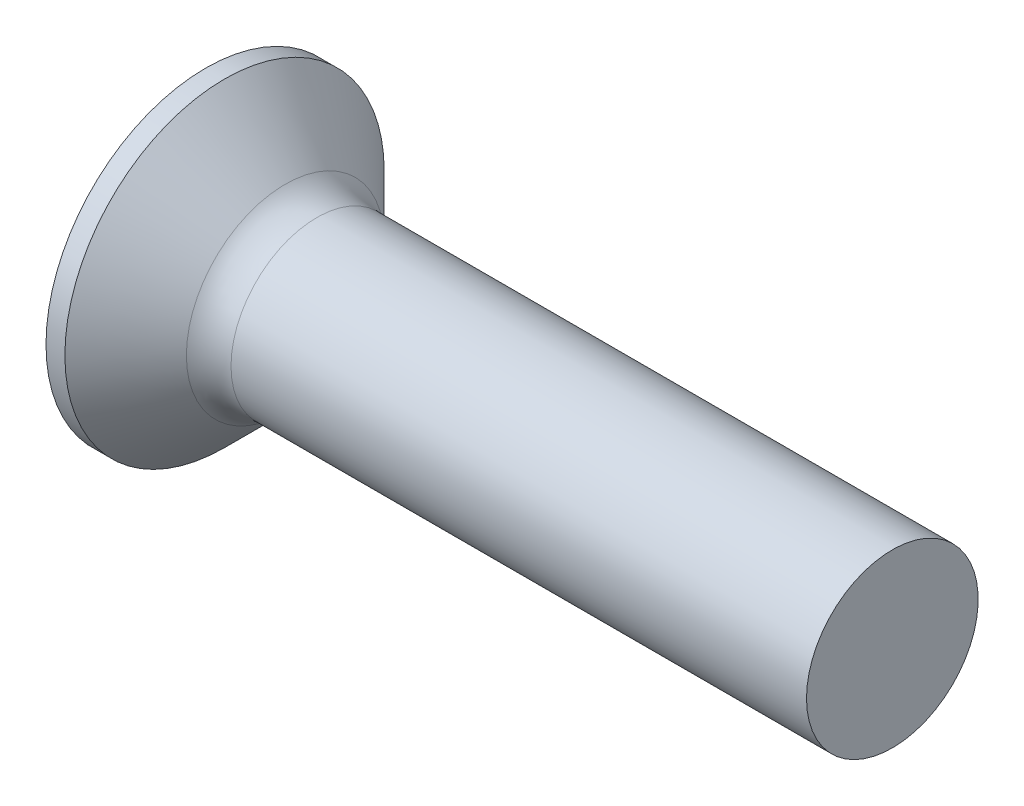
ISO-10303-21;
HEADER;
FILE_DESCRIPTION(('STEP AP214'),'2;1');
FILE_NAME('part.step','',(''),(''),'','','');
FILE_SCHEMA(('AUTOMOTIVE_DESIGN { 1 0 10303 214 1 1 1 1 }'));
ENDSEC;
DATA;
#1=APPLICATION_CONTEXT('core data for automotive mechanical design processes');
#2=APPLICATION_PROTOCOL_DEFINITION('international standard','automotive_design',2000,#1);
#3=PRODUCT_CONTEXT('',#1,'mechanical');
#4=PRODUCT('Part','Part','',(#3));
#5=PRODUCT_RELATED_PRODUCT_CATEGORY('part','',(#4));
#6=PRODUCT_DEFINITION_FORMATION('','',#4);
#7=PRODUCT_DEFINITION_CONTEXT('part definition',#1,'design');
#8=PRODUCT_DEFINITION('design','',#6,#7);
#9=PRODUCT_DEFINITION_SHAPE('','',#8);
#10=(LENGTH_UNIT() NAMED_UNIT(*) SI_UNIT(.MILLI.,.METRE.));
#11=(NAMED_UNIT(*) PLANE_ANGLE_UNIT() SI_UNIT($,.RADIAN.));
#12=(NAMED_UNIT(*) SI_UNIT($,.STERADIAN.) SOLID_ANGLE_UNIT());
#13=UNCERTAINTY_MEASURE_WITH_UNIT(LENGTH_MEASURE(1.E-05),#10,'distance_accuracy_value','');
#14=(GEOMETRIC_REPRESENTATION_CONTEXT(3) GLOBAL_UNCERTAINTY_ASSIGNED_CONTEXT((#13)) GLOBAL_UNIT_ASSIGNED_CONTEXT((#10,
#11,#12)) REPRESENTATION_CONTEXT('',''));
#15=CARTESIAN_POINT('',(0.,0.,0.));
#16=DIRECTION('',(0.,0.,1.));
#17=DIRECTION('',(1.,0.,0.));
#18=AXIS2_PLACEMENT_3D('',#15,#16,#17);
#19=CARTESIAN_POINT('',(0.,0.,0.));
#20=DIRECTION('',(-1.,0.,0.));
#21=DIRECTION('',(0.,0.,1.));
#22=AXIS2_PLACEMENT_3D('',#19,#20,#21);
#23=PLANE('',#22);
#24=CARTESIAN_POINT('',(0.,0.,0.));
#25=DIRECTION('',(-1.,0.,0.));
#26=DIRECTION('',(0.,0.,1.));
#27=AXIS2_PLACEMENT_3D('',#24,#25,#26);
#28=CIRCLE('',#27,4.65);
#29=CARTESIAN_POINT('',(0.,0.,4.65));
#30=VERTEX_POINT('',#29);
#31=EDGE_CURVE('E323',#30,#30,#28,.T.);
#32=ORIENTED_EDGE('',*,*,#31,.T.);
#33=EDGE_LOOP('',(#32));
#34=FACE_BOUND('',#33,.T.);
#35=DIRECTION('',(0.,0.,-1.));
#36=VECTOR('',#35,1.);
#37=CARTESIAN_POINT('',(0.,-0.515000000000009,2.45));
#38=LINE('',#37,#36);
#39=CARTESIAN_POINT('',(0.,-0.515000000000009,2.45));
#40=VERTEX_POINT('',#39);
#41=CARTESIAN_POINT('',(0.,-0.515000000000003,0.931375357653024));
#42=VERTEX_POINT('',#41);
#43=EDGE_CURVE('E344',#40,#42,#38,.T.);
#44=ORIENTED_EDGE('',*,*,#43,.T.);
#45=CARTESIAN_POINT('',(0.,0.,0.));
#46=DIRECTION('',(-1.,0.,0.));
#47=DIRECTION('',(0.,0.,1.));
#48=AXIS2_PLACEMENT_3D('',#45,#46,#47);
#49=CIRCLE('',#48,1.06427677642768);
#50=CARTESIAN_POINT('',(0.,-0.931375357653026,0.515));
#51=VERTEX_POINT('',#50);
#52=EDGE_CURVE('E416',#51,#42,#49,.T.);
#53=ORIENTED_EDGE('',*,*,#52,.F.);
#54=DIRECTION('',(0.,-1.,0.));
#55=VECTOR('',#54,1.);
#56=CARTESIAN_POINT('',(0.,2.45,0.515));
#57=LINE('',#56,#55);
#58=CARTESIAN_POINT('',(0.,-2.45,0.515));
#59=VERTEX_POINT('',#58);
#60=EDGE_CURVE('E295',#51,#59,#57,.T.);
#61=ORIENTED_EDGE('',*,*,#60,.T.);
#62=DIRECTION('',(0.,0.,-1.));
#63=VECTOR('',#62,1.);
#64=CARTESIAN_POINT('',(0.,-2.45,0.515));
#65=LINE('',#64,#63);
#66=CARTESIAN_POINT('',(0.,-2.45,-0.515));
#67=VERTEX_POINT('',#66);
#68=EDGE_CURVE('E278',#59,#67,#65,.T.);
#69=ORIENTED_EDGE('',*,*,#68,.T.);
#70=DIRECTION('',(0.,1.,0.));
#71=VECTOR('',#70,1.);
#72=CARTESIAN_POINT('',(0.,-2.45,-0.515));
#73=LINE('',#72,#71);
#74=CARTESIAN_POINT('',(0.,-0.931375357653026,-0.515));
#75=VERTEX_POINT('',#74);
#76=EDGE_CURVE('E287',#67,#75,#73,.T.);
#77=ORIENTED_EDGE('',*,*,#76,.T.);
#78=CARTESIAN_POINT('',(0.,-0.514999999999997,-0.931375357653028));
#79=VERTEX_POINT('',#78);
#80=EDGE_CURVE('E401',#79,#75,#49,.T.);
#81=ORIENTED_EDGE('',*,*,#80,.F.);
#82=CARTESIAN_POINT('',(0.,-0.514999999999992,-2.45));
#83=VERTEX_POINT('',#82);
#84=EDGE_CURVE('E348',#79,#83,#38,.T.);
#85=ORIENTED_EDGE('',*,*,#84,.T.);
#86=DIRECTION('',(0.,1.,0.));
#87=VECTOR('',#86,1.);
#88=CARTESIAN_POINT('',(0.,-0.514999999999992,-2.45));
#89=LINE('',#88,#87);
#90=CARTESIAN_POINT('',(0.,0.515000000000008,-2.45));
#91=VERTEX_POINT('',#90);
#92=EDGE_CURVE('E337',#83,#91,#89,.T.);
#93=ORIENTED_EDGE('',*,*,#92,.T.);
#94=DIRECTION('',(0.,0.,1.));
#95=VECTOR('',#94,1.);
#96=CARTESIAN_POINT('',(0.,0.515000000000008,-2.45));
#97=LINE('',#96,#95);
#98=CARTESIAN_POINT('',(0.,0.515000000000003,-0.931375357653024));
#99=VERTEX_POINT('',#98);
#100=EDGE_CURVE('E352',#91,#99,#97,.T.);
#101=ORIENTED_EDGE('',*,*,#100,.T.);
#102=CARTESIAN_POINT('',(0.,0.931375357653026,-0.515));
#103=VERTEX_POINT('',#102);
#104=EDGE_CURVE('E414',#103,#99,#49,.T.);
#105=ORIENTED_EDGE('',*,*,#104,.F.);
#106=CARTESIAN_POINT('',(0.,2.45,-0.515));
#107=VERTEX_POINT('',#106);
#108=EDGE_CURVE('E290',#103,#107,#73,.T.);
#109=ORIENTED_EDGE('',*,*,#108,.T.);
#110=DIRECTION('',(0.,0.,1.));
#111=VECTOR('',#110,1.);
#112=CARTESIAN_POINT('',(0.,2.45,-0.515));
#113=LINE('',#112,#111);
#114=CARTESIAN_POINT('',(0.,2.45,0.515));
#115=VERTEX_POINT('',#114);
#116=EDGE_CURVE('E289',#107,#115,#113,.T.);
#117=ORIENTED_EDGE('',*,*,#116,.T.);
#118=CARTESIAN_POINT('',(0.,0.931375357653026,0.515));
#119=VERTEX_POINT('',#118);
#120=EDGE_CURVE('E297',#115,#119,#57,.T.);
#121=ORIENTED_EDGE('',*,*,#120,.T.);
#122=CARTESIAN_POINT('',(0.,0.514999999999996,0.931375357653028));
#123=VERTEX_POINT('',#122);
#124=EDGE_CURVE('E415',#123,#119,#49,.T.);
#125=ORIENTED_EDGE('',*,*,#124,.F.);
#126=CARTESIAN_POINT('',(0.,0.514999999999991,2.45));
#127=VERTEX_POINT('',#126);
#128=EDGE_CURVE('E355',#123,#127,#97,.T.);
#129=ORIENTED_EDGE('',*,*,#128,.T.);
#130=DIRECTION('',(0.,-1.,0.));
#131=VECTOR('',#130,1.);
#132=CARTESIAN_POINT('',(0.,0.514999999999991,2.45));
#133=LINE('',#132,#131);
#134=EDGE_CURVE('E354',#127,#40,#133,.T.);
#135=ORIENTED_EDGE('',*,*,#134,.T.);
#136=EDGE_LOOP('',(#44,#53,#61,#69,#77,#81,#85,#93,#101,#105,#109,#117,#121,#125,#129,#135));
#137=FACE_BOUND('',#136,.T.);
#138=ADVANCED_FACE('F32',(#34,#137),#23,.T.);
#139=CARTESIAN_POINT('',(3.05,-0.929326147908032,0.515));
#140=DIRECTION('',(0.,0.,-1.));
#141=DIRECTION('',(0.,1.,0.));
#142=AXIS2_PLACEMENT_3D('',#139,#140,#141);
#143=PLANE('',#142);
#144=ORIENTED_EDGE('',*,*,#60,.F.);
#145=CARTESIAN_POINT('',(-1.54221347058903,-1.05291860714859,0.515));
#146=CARTESIAN_POINT('',(-1.22007146800241,-1.02783606985067,0.515));
#147=CARTESIAN_POINT('',(-0.897941814894598,-1.00259289382691,0.515));
#148=CARTESIAN_POINT('',(-0.253713841602367,-0.951673528708394,0.515));
#149=CARTESIAN_POINT('',(0.0683844782739392,-0.925997335718344,0.515));
#150=CARTESIAN_POINT('',(0.712537341258934,-0.874100649402746,0.515));
#151=CARTESIAN_POINT('',(1.03459188436907,-0.847880156095195,0.515));
#152=CARTESIAN_POINT('',(1.67864013806642,-0.794723211090118,0.515));
#153=CARTESIAN_POINT('',(2.00063384900369,-0.767786763647266,0.515));
#154=CARTESIAN_POINT('',(2.56056239424054,-0.720091607757629,0.515));
#155=CARTESIAN_POINT('',(2.79851603156427,-0.699554136405275,0.515));
#156=CARTESIAN_POINT('',(3.27436149685826,-0.657782810337244,0.515));
#157=CARTESIAN_POINT('',(3.51225332501977,-0.636548957802634,0.515));
#158=CARTESIAN_POINT('',(3.98796007502083,-0.593165171209449,0.515));
#159=CARTESIAN_POINT('',(4.22577499483827,-0.571015214770186,0.515));
#160=CARTESIAN_POINT('',(4.70127802510734,-0.525368928080089,0.515));
#161=CARTESIAN_POINT('',(4.93896613402064,-0.501872581855082,0.515));
#162=CARTESIAN_POINT('',(5.17656597211643,-0.477487907039094,0.515));
#163=B_SPLINE_CURVE_WITH_KNOTS('',3,(#145,#146,#147,#148,#149,#150,#151,#152,#153,#154,#155,
#156,#157,#158,#159,#160,#161,#162),.UNSPECIFIED.,.F.,.F.,(4,2,2,2,2,2,2,2,4),(0.,
0.969351235034601,1.93871119472626,2.90807112236582,3.87742529071622,4.59393929261848,
5.3104510506131,6.02698032355223,6.74351809947659),.UNSPECIFIED.);
#164=CARTESIAN_POINT('',(3.05,-0.677477674908922,0.515));
#165=VERTEX_POINT('',#164);
#166=EDGE_CURVE('E392',#51,#165,#163,.T.);
#167=ORIENTED_EDGE('',*,*,#166,.T.);
#168=DIRECTION('',(0.,-1.,0.));
#169=VECTOR('',#168,1.);
#170=CARTESIAN_POINT('',(3.05,0.929326147908032,0.515));
#171=LINE('',#170,#169);
#172=CARTESIAN_POINT('',(3.05,-0.929326147908032,0.515));
#173=VERTEX_POINT('',#172);
#174=EDGE_CURVE('E313',#165,#173,#171,.T.);
#175=ORIENTED_EDGE('',*,*,#174,.T.);
#176=DIRECTION('',(0.89493436774996,0.446197800778958,0.));
#177=VECTOR('',#176,1.);
#178=CARTESIAN_POINT('',(0.,-2.45,0.515));
#179=LINE('',#178,#177);
#180=EDGE_CURVE('E284',#59,#173,#179,.T.);
#181=ORIENTED_EDGE('',*,*,#180,.F.);
#182=EDGE_LOOP('',(#144,#167,#175,#181));
#183=FACE_BOUND('',#182,.T.);
#184=ADVANCED_FACE('F164',(#183),#143,.T.);
#185=CARTESIAN_POINT('',(3.05,0.929326147908032,0.515));
#186=VERTEX_POINT('',#185);
#187=CARTESIAN_POINT('',(3.05,0.677477674908922,0.515));
#188=VERTEX_POINT('',#187);
#189=EDGE_CURVE('E315',#186,#188,#171,.T.);
#190=ORIENTED_EDGE('',*,*,#189,.T.);
#191=CARTESIAN_POINT('',(-1.54221347058903,1.05291860714859,0.515));
#192=CARTESIAN_POINT('',(-1.22007146800241,1.02783606985067,0.515));
#193=CARTESIAN_POINT('',(-0.897941814894598,1.00259289382691,0.515));
#194=CARTESIAN_POINT('',(-0.253713841602368,0.951673528708394,0.515));
#195=CARTESIAN_POINT('',(0.0683844782739386,0.925997335718344,0.515));
#196=CARTESIAN_POINT('',(0.712537341258934,0.874100649402746,0.515));
#197=CARTESIAN_POINT('',(1.03459188436907,0.847880156095195,0.515));
#198=CARTESIAN_POINT('',(1.67864013806642,0.794723211090119,0.515));
#199=CARTESIAN_POINT('',(2.00063384900369,0.767786763647266,0.515));
#200=CARTESIAN_POINT('',(2.56056239424054,0.720091607757629,0.515));
#201=CARTESIAN_POINT('',(2.79851603156427,0.699554136405274,0.515));
#202=CARTESIAN_POINT('',(3.27436149685826,0.657782810337244,0.515));
#203=CARTESIAN_POINT('',(3.51225332501977,0.636548957802634,0.515));
#204=CARTESIAN_POINT('',(3.98796007502083,0.593165171209449,0.515));
#205=CARTESIAN_POINT('',(4.22577499483828,0.571015214770186,0.515));
#206=CARTESIAN_POINT('',(4.70127802510735,0.525368928080088,0.515));
#207=CARTESIAN_POINT('',(4.93896613402064,0.501872581855082,0.515));
#208=CARTESIAN_POINT('',(5.17656597211643,0.477487907039094,0.515));
#209=B_SPLINE_CURVE_WITH_KNOTS('',3,(#191,#192,#193,#194,#195,#196,#197,#198,#199,#200,#201,
#202,#203,#204,#205,#206,#207,#208),.UNSPECIFIED.,.F.,.F.,(4,2,2,2,2,2,2,2,4),(0.,
0.9693512350346,1.93871119472626,2.90807112236582,3.87742529071622,4.59393929261848,
5.3104510506131,6.02698032355223,6.74351809947659),.UNSPECIFIED.);
#210=EDGE_CURVE('E224',#188,#119,#209,.F.);
#211=ORIENTED_EDGE('',*,*,#210,.T.);
#212=ORIENTED_EDGE('',*,*,#120,.F.);
#213=DIRECTION('',(0.89493436774996,-0.446197800778958,0.));
#214=VECTOR('',#213,1.);
#215=CARTESIAN_POINT('',(0.,2.45,0.515));
#216=LINE('',#215,#214);
#217=EDGE_CURVE('E60',#115,#186,#216,.T.);
#218=ORIENTED_EDGE('',*,*,#217,.T.);
#219=EDGE_LOOP('',(#190,#211,#212,#218));
#220=FACE_BOUND('',#219,.T.);
#221=ADVANCED_FACE('F169',(#220),#143,.T.);
#222=CARTESIAN_POINT('',(3.05,0.929326147908032,-0.515));
#223=DIRECTION('',(0.,0.,1.));
#224=DIRECTION('',(1.,0.,0.));
#225=AXIS2_PLACEMENT_3D('',#222,#223,#224);
#226=PLANE('',#225);
#227=DIRECTION('',(0.,1.,0.));
#228=VECTOR('',#227,1.);
#229=CARTESIAN_POINT('',(3.05,-0.929326147908032,-0.515));
#230=LINE('',#229,#228);
#231=CARTESIAN_POINT('',(3.05,-0.929326147908032,-0.515));
#232=VERTEX_POINT('',#231);
#233=CARTESIAN_POINT('',(3.05,-0.677477674908922,-0.515));
#234=VERTEX_POINT('',#233);
#235=EDGE_CURVE('E314',#232,#234,#230,.T.);
#236=ORIENTED_EDGE('',*,*,#235,.T.);
#237=CARTESIAN_POINT('',(-1.54221347058903,-1.05291860714859,-0.514999999999999));
#238=CARTESIAN_POINT('',(-1.22007146800241,-1.02783606985067,-0.514999999999999));
#239=CARTESIAN_POINT('',(-0.897941814894597,-1.00259289382691,-0.515));
#240=CARTESIAN_POINT('',(-0.253713841602367,-0.951673528708394,-0.515));
#241=CARTESIAN_POINT('',(0.0683844782739392,-0.925997335718344,-0.515));
#242=CARTESIAN_POINT('',(0.712537341258934,-0.874100649402746,-0.515));
#243=CARTESIAN_POINT('',(1.03459188436907,-0.847880156095195,-0.515));
#244=CARTESIAN_POINT('',(1.67864013806642,-0.794723211090119,-0.515));
#245=CARTESIAN_POINT('',(2.00063384900369,-0.767786763647266,-0.515));
#246=CARTESIAN_POINT('',(2.56056239424054,-0.720091607757629,-0.515));
#247=CARTESIAN_POINT('',(2.79851603156427,-0.699554136405275,-0.515));
#248=CARTESIAN_POINT('',(3.27436149685826,-0.657782810337244,-0.515));
#249=CARTESIAN_POINT('',(3.51225332501977,-0.636548957802634,-0.515));
#250=CARTESIAN_POINT('',(3.98796007502083,-0.593165171209449,-0.515));
#251=CARTESIAN_POINT('',(4.22577499483828,-0.571015214770186,-0.515));
#252=CARTESIAN_POINT('',(4.70127802510735,-0.525368928080088,-0.515));
#253=CARTESIAN_POINT('',(4.93896613402064,-0.501872581855082,-0.515));
#254=CARTESIAN_POINT('',(5.17656597211643,-0.477487907039094,-0.515));
#255=B_SPLINE_CURVE_WITH_KNOTS('',3,(#237,#238,#239,#240,#241,#242,#243,#244,#245,#246,#247,
#248,#249,#250,#251,#252,#253,#254),.UNSPECIFIED.,.F.,.F.,(4,2,2,2,2,2,2,2,4),(0.,
0.969351235034601,1.93871119472626,2.90807112236582,3.87742529071622,4.59393929261848,
5.3104510506131,6.02698032355223,6.74351809947659),.UNSPECIFIED.);
#256=EDGE_CURVE('E218',#234,#75,#255,.F.);
#257=ORIENTED_EDGE('',*,*,#256,.T.);
#258=ORIENTED_EDGE('',*,*,#76,.F.);
#259=DIRECTION('',(0.89493436774996,0.446197800778958,0.));
#260=VECTOR('',#259,1.);
#261=CARTESIAN_POINT('',(0.,-2.45,-0.515));
#262=LINE('',#261,#260);
#263=EDGE_CURVE('E274',#67,#232,#262,.T.);
#264=ORIENTED_EDGE('',*,*,#263,.T.);
#265=EDGE_LOOP('',(#236,#257,#258,#264));
#266=FACE_BOUND('',#265,.T.);
#267=ADVANCED_FACE('F204',(#266),#226,.T.);
#268=ORIENTED_EDGE('',*,*,#108,.F.);
#269=CARTESIAN_POINT('',(-1.54221347058903,1.05291860714859,-0.514999999999999));
#270=CARTESIAN_POINT('',(-1.22007146800241,1.02783606985067,-0.514999999999999));
#271=CARTESIAN_POINT('',(-0.897941814894598,1.00259289382691,-0.515));
#272=CARTESIAN_POINT('',(-0.253713841602367,0.951673528708394,-0.515));
#273=CARTESIAN_POINT('',(0.0683844782739391,0.925997335718344,-0.515));
#274=CARTESIAN_POINT('',(0.712537341258933,0.874100649402746,-0.515));
#275=CARTESIAN_POINT('',(1.03459188436907,0.847880156095195,-0.515));
#276=CARTESIAN_POINT('',(1.67864013806642,0.794723211090119,-0.515));
#277=CARTESIAN_POINT('',(2.00063384900369,0.767786763647266,-0.515));
#278=CARTESIAN_POINT('',(2.56056239424054,0.720091607757629,-0.515));
#279=CARTESIAN_POINT('',(2.79851603156427,0.699554136405275,-0.515));
#280=CARTESIAN_POINT('',(3.27436149685826,0.657782810337244,-0.515));
#281=CARTESIAN_POINT('',(3.51225332501977,0.636548957802634,-0.515));
#282=CARTESIAN_POINT('',(3.98796007502083,0.593165171209449,-0.515));
#283=CARTESIAN_POINT('',(4.22577499483827,0.571015214770186,-0.515));
#284=CARTESIAN_POINT('',(4.70127802510734,0.525368928080089,-0.515));
#285=CARTESIAN_POINT('',(4.93896613402064,0.501872581855082,-0.515));
#286=CARTESIAN_POINT('',(5.17656597211643,0.477487907039094,-0.515));
#287=B_SPLINE_CURVE_WITH_KNOTS('',3,(#269,#270,#271,#272,#273,#274,#275,#276,#277,#278,#279,
#280,#281,#282,#283,#284,#285,#286),.UNSPECIFIED.,.F.,.F.,(4,2,2,2,2,2,2,2,4),(0.,
0.969351235034601,1.93871119472626,2.90807112236582,3.87742529071622,4.59393929261848,
5.3104510506131,6.02698032355223,6.74351809947659),.UNSPECIFIED.);
#288=CARTESIAN_POINT('',(3.05,0.677477674908922,-0.515));
#289=VERTEX_POINT('',#288);
#290=EDGE_CURVE('E212',#103,#289,#287,.T.);
#291=ORIENTED_EDGE('',*,*,#290,.T.);
#292=CARTESIAN_POINT('',(3.05,0.929326147908032,-0.515));
#293=VERTEX_POINT('',#292);
#294=EDGE_CURVE('E319',#289,#293,#230,.T.);
#295=ORIENTED_EDGE('',*,*,#294,.T.);
#296=DIRECTION('',(0.89493436774996,-0.446197800778958,0.));
#297=VECTOR('',#296,1.);
#298=CARTESIAN_POINT('',(0.,2.45,-0.515));
#299=LINE('',#298,#297);
#300=EDGE_CURVE('E308',#107,#293,#299,.T.);
#301=ORIENTED_EDGE('',*,*,#300,.F.);
#302=EDGE_LOOP('',(#268,#291,#295,#301));
#303=FACE_BOUND('',#302,.T.);
#304=ADVANCED_FACE('F196',(#303),#226,.T.);
#305=CARTESIAN_POINT('',(3.05,0.929326147908032,-0.515));
#306=DIRECTION('',(1.,0.,0.));
#307=DIRECTION('',(0.,0.,-1.));
#308=AXIS2_PLACEMENT_3D('',#305,#306,#307);
#309=PLANE('',#308);
#310=CARTESIAN_POINT('',(3.05,0.,0.));
#311=DIRECTION('',(-1.,0.,0.));
#312=DIRECTION('',(0.,0.,1.));
#313=AXIS2_PLACEMENT_3D('',#310,#311,#312);
#314=CIRCLE('',#313,0.850999999999999);
#315=EDGE_CURVE('E423',#234,#165,#314,.T.);
#316=ORIENTED_EDGE('',*,*,#315,.F.);
#317=ORIENTED_EDGE('',*,*,#235,.F.);
#318=DIRECTION('',(0.,0.,-1.));
#319=VECTOR('',#318,1.);
#320=CARTESIAN_POINT('',(3.05,-0.929326147908032,0.515));
#321=LINE('',#320,#319);
#322=EDGE_CURVE('E281',#173,#232,#321,.T.);
#323=ORIENTED_EDGE('',*,*,#322,.F.);
#324=ORIENTED_EDGE('',*,*,#174,.F.);
#325=EDGE_LOOP('',(#316,#317,#323,#324));
#326=FACE_BOUND('',#325,.T.);
#327=ADVANCED_FACE('F192',(#326),#309,.F.);
#328=CARTESIAN_POINT('',(3.05,-0.515000000000002,0.67747767490892));
#329=VERTEX_POINT('',#328);
#330=CARTESIAN_POINT('',(3.05,0.514999999999998,0.677477674908924));
#331=VERTEX_POINT('',#330);
#332=EDGE_CURVE('E418',#329,#331,#314,.T.);
#333=ORIENTED_EDGE('',*,*,#332,.F.);
#334=DIRECTION('',(0.,0.,-1.));
#335=VECTOR('',#334,1.);
#336=CARTESIAN_POINT('',(3.05,-0.515000000000003,0.92932614790803));
#337=LINE('',#336,#335);
#338=CARTESIAN_POINT('',(3.05,-0.515000000000003,0.92932614790803));
#339=VERTEX_POINT('',#338);
#340=EDGE_CURVE('E373',#339,#329,#337,.T.);
#341=ORIENTED_EDGE('',*,*,#340,.F.);
#342=DIRECTION('',(0.,-1.,0.));
#343=VECTOR('',#342,1.);
#344=CARTESIAN_POINT('',(3.05,0.514999999999997,0.929326147908034));
#345=LINE('',#344,#343);
#346=CARTESIAN_POINT('',(3.05,0.514999999999997,0.929326147908034));
#347=VERTEX_POINT('',#346);
#348=EDGE_CURVE('E368',#347,#339,#345,.T.);
#349=ORIENTED_EDGE('',*,*,#348,.F.);
#350=DIRECTION('',(0.,0.,1.));
#351=VECTOR('',#350,1.);
#352=CARTESIAN_POINT('',(3.05,0.515000000000003,-0.929326147908031));
#353=LINE('',#352,#351);
#354=EDGE_CURVE('E378',#331,#347,#353,.T.);
#355=ORIENTED_EDGE('',*,*,#354,.F.);
#356=EDGE_LOOP('',(#333,#341,#349,#355));
#357=FACE_BOUND('',#356,.T.);
#358=ADVANCED_FACE('F195',(#357),#309,.F.);
#359=EDGE_CURVE('E389',#188,#289,#314,.T.);
#360=ORIENTED_EDGE('',*,*,#359,.F.);
#361=ORIENTED_EDGE('',*,*,#189,.F.);
#362=DIRECTION('',(0.,0.,1.));
#363=VECTOR('',#362,1.);
#364=CARTESIAN_POINT('',(3.05,0.929326147908032,-0.515));
#365=LINE('',#364,#363);
#366=EDGE_CURVE('E311',#293,#186,#365,.T.);
#367=ORIENTED_EDGE('',*,*,#366,.F.);
#368=ORIENTED_EDGE('',*,*,#294,.F.);
#369=EDGE_LOOP('',(#360,#361,#367,#368));
#370=FACE_BOUND('',#369,.T.);
#371=ADVANCED_FACE('F386',(#370),#309,.F.);
#372=CARTESIAN_POINT('',(3.05,0.515000000000002,-0.67747767490892));
#373=VERTEX_POINT('',#372);
#374=CARTESIAN_POINT('',(3.05,-0.514999999999998,-0.677477674908923));
#375=VERTEX_POINT('',#374);
#376=EDGE_CURVE('E413',#373,#375,#314,.T.);
#377=ORIENTED_EDGE('',*,*,#376,.F.);
#378=CARTESIAN_POINT('',(3.05,0.515000000000003,-0.929326147908031));
#379=VERTEX_POINT('',#378);
#380=EDGE_CURVE('E372',#379,#373,#353,.T.);
#381=ORIENTED_EDGE('',*,*,#380,.F.);
#382=DIRECTION('',(0.,1.,0.));
#383=VECTOR('',#382,1.);
#384=CARTESIAN_POINT('',(3.05,-0.514999999999997,-0.929326147908034));
#385=LINE('',#384,#383);
#386=CARTESIAN_POINT('',(3.05,-0.514999999999997,-0.929326147908034));
#387=VERTEX_POINT('',#386);
#388=EDGE_CURVE('E367',#387,#379,#385,.T.);
#389=ORIENTED_EDGE('',*,*,#388,.F.);
#390=EDGE_CURVE('E371',#375,#387,#337,.T.);
#391=ORIENTED_EDGE('',*,*,#390,.F.);
#392=EDGE_LOOP('',(#377,#381,#389,#391));
#393=FACE_BOUND('',#392,.T.);
#394=ADVANCED_FACE('F198',(#393),#309,.F.);
#395=CARTESIAN_POINT('',(3.05,0.514999999999997,0.929326147908034));
#396=DIRECTION('',(0.,-1.,0.));
#397=DIRECTION('',(1.,0.,0.));
#398=AXIS2_PLACEMENT_3D('',#395,#396,#397);
#399=PLANE('',#398);
#400=ORIENTED_EDGE('',*,*,#380,.T.);
#401=CARTESIAN_POINT('',(-1.54221347058903,0.515000000000003,-1.05291860714859));
#402=CARTESIAN_POINT('',(-1.22007146800241,0.515000000000003,-1.02783606985067));
#403=CARTESIAN_POINT('',(-0.897941814894598,0.515000000000003,-1.00259289382691));
#404=CARTESIAN_POINT('',(-0.253713841602368,0.515000000000003,-0.951673528708392));
#405=CARTESIAN_POINT('',(0.068384478273939,0.515000000000003,-0.925997335718343));
#406=CARTESIAN_POINT('',(0.712537341258934,0.515000000000003,-0.874100649402744));
#407=CARTESIAN_POINT('',(1.03459188436907,0.515000000000003,-0.847880156095193));
#408=CARTESIAN_POINT('',(1.67864013806642,0.515000000000003,-0.794723211090117));
#409=CARTESIAN_POINT('',(2.00063384900369,0.515000000000003,-0.767786763647264));
#410=CARTESIAN_POINT('',(2.56056239424054,0.515000000000003,-0.720091607757627));
#411=CARTESIAN_POINT('',(2.79851603156427,0.515000000000003,-0.699554136405273));
#412=CARTESIAN_POINT('',(3.27436149685826,0.515000000000002,-0.657782810337242));
#413=CARTESIAN_POINT('',(3.51225332501977,0.515000000000002,-0.636548957802632));
#414=CARTESIAN_POINT('',(3.98796007502083,0.515000000000002,-0.593165171209447));
#415=CARTESIAN_POINT('',(4.22577499483828,0.515000000000002,-0.571015214770184));
#416=CARTESIAN_POINT('',(4.70127802510735,0.515000000000002,-0.525368928080087));
#417=CARTESIAN_POINT('',(4.93896613402064,0.515000000000002,-0.50187258185508));
#418=CARTESIAN_POINT('',(5.17656597211643,0.515000000000002,-0.477487907039092));
#419=B_SPLINE_CURVE_WITH_KNOTS('',3,(#401,#402,#403,#404,#405,#406,#407,#408,#409,#410,#411,
#412,#413,#414,#415,#416,#417,#418),.UNSPECIFIED.,.F.,.F.,(4,2,2,2,2,2,2,2,4),(0.,
0.969351235034601,1.93871119472626,2.90807112236582,3.87742529071622,4.59393929261848,
5.3104510506131,6.02698032355223,6.74351809947659),.UNSPECIFIED.);
#420=EDGE_CURVE('E249',#373,#99,#419,.F.);
#421=ORIENTED_EDGE('',*,*,#420,.T.);
#422=ORIENTED_EDGE('',*,*,#100,.F.);
#423=DIRECTION('',(0.89493436774996,0.,0.446197800778958));
#424=VECTOR('',#423,1.);
#425=CARTESIAN_POINT('',(0.,0.515000000000008,-2.45));
#426=LINE('',#425,#424);
#427=EDGE_CURVE('E359',#91,#379,#426,.T.);
#428=ORIENTED_EDGE('',*,*,#427,.T.);
#429=EDGE_LOOP('',(#400,#421,#422,#428));
#430=FACE_BOUND('',#429,.T.);
#431=ADVANCED_FACE('F255',(#430),#399,.T.);
#432=CARTESIAN_POINT('',(3.05,-0.514999999999997,-0.929326147908034));
#433=DIRECTION('',(0.,1.,0.));
#434=DIRECTION('',(0.,0.,1.));
#435=AXIS2_PLACEMENT_3D('',#432,#433,#434);
#436=PLANE('',#435);
#437=ORIENTED_EDGE('',*,*,#84,.F.);
#438=CARTESIAN_POINT('',(-1.54221347058903,-0.514999999999996,-1.05291860714859));
#439=CARTESIAN_POINT('',(-1.22007146800241,-0.514999999999997,-1.02783606985067));
#440=CARTESIAN_POINT('',(-0.897941814894598,-0.514999999999997,-1.00259289382691));
#441=CARTESIAN_POINT('',(-0.253713841602368,-0.514999999999997,-0.951673528708395));
#442=CARTESIAN_POINT('',(0.0683844782739388,-0.514999999999997,-0.925997335718346));
#443=CARTESIAN_POINT('',(0.712537341258934,-0.514999999999997,-0.874100649402748));
#444=CARTESIAN_POINT('',(1.03459188436907,-0.514999999999997,-0.847880156095197));
#445=CARTESIAN_POINT('',(1.67864013806642,-0.514999999999997,-0.79472321109012));
#446=CARTESIAN_POINT('',(2.00063384900369,-0.514999999999998,-0.767786763647267));
#447=CARTESIAN_POINT('',(2.56056239424054,-0.514999999999998,-0.72009160775763));
#448=CARTESIAN_POINT('',(2.79851603156427,-0.514999999999998,-0.699554136405276));
#449=CARTESIAN_POINT('',(3.27436149685826,-0.514999999999998,-0.657782810337246));
#450=CARTESIAN_POINT('',(3.51225332501977,-0.514999999999998,-0.636548957802636));
#451=CARTESIAN_POINT('',(3.98796007502083,-0.514999999999998,-0.59316517120945));
#452=CARTESIAN_POINT('',(4.22577499483828,-0.514999999999998,-0.571015214770188));
#453=CARTESIAN_POINT('',(4.70127802510735,-0.514999999999998,-0.52536892808009));
#454=CARTESIAN_POINT('',(4.93896613402064,-0.514999999999999,-0.501872581855084));
#455=CARTESIAN_POINT('',(5.17656597211643,-0.514999999999999,-0.477487907039096));
#456=B_SPLINE_CURVE_WITH_KNOTS('',3,(#438,#439,#440,#441,#442,#443,#444,#445,#446,#447,#448,
#449,#450,#451,#452,#453,#454,#455),.UNSPECIFIED.,.F.,.F.,(4,2,2,2,2,2,2,2,4),(0.,
0.9693512350346,1.93871119472626,2.90807112236582,3.87742529071622,4.59393929261848,
5.3104510506131,6.02698032355223,6.74351809947659),.UNSPECIFIED.);
#457=EDGE_CURVE('E244',#79,#375,#456,.T.);
#458=ORIENTED_EDGE('',*,*,#457,.T.);
#459=ORIENTED_EDGE('',*,*,#390,.T.);
#460=DIRECTION('',(0.89493436774996,0.,0.446197800778958));
#461=VECTOR('',#460,1.);
#462=CARTESIAN_POINT('',(0.,-0.514999999999992,-2.45));
#463=LINE('',#462,#461);
#464=EDGE_CURVE('E356',#83,#387,#463,.T.);
#465=ORIENTED_EDGE('',*,*,#464,.F.);
#466=EDGE_LOOP('',(#437,#458,#459,#465));
#467=FACE_BOUND('',#466,.T.);
#468=ADVANCED_FACE('F259',(#467),#436,.T.);
#469=ORIENTED_EDGE('',*,*,#340,.T.);
#470=CARTESIAN_POINT('',(-1.54221347058903,-0.515000000000004,1.05291860714859));
#471=CARTESIAN_POINT('',(-1.22007146800241,-0.515000000000004,1.02783606985067));
#472=CARTESIAN_POINT('',(-0.897941814894598,-0.515000000000004,1.00259289382691));
#473=CARTESIAN_POINT('',(-0.253713841602368,-0.515000000000003,0.951673528708392));
#474=CARTESIAN_POINT('',(0.068384478273939,-0.515000000000003,0.925997335718342));
#475=CARTESIAN_POINT('',(0.712537341258934,-0.515000000000003,0.874100649402744));
#476=CARTESIAN_POINT('',(1.03459188436907,-0.515000000000003,0.847880156095193));
#477=CARTESIAN_POINT('',(1.67864013806642,-0.515000000000003,0.794723211090117));
#478=CARTESIAN_POINT('',(2.00063384900369,-0.515000000000003,0.767786763647264));
#479=CARTESIAN_POINT('',(2.56056239424054,-0.515000000000003,0.720091607757627));
#480=CARTESIAN_POINT('',(2.79851603156427,-0.515000000000003,0.699554136405273));
#481=CARTESIAN_POINT('',(3.27436149685826,-0.515000000000002,0.657782810337243));
#482=CARTESIAN_POINT('',(3.51225332501977,-0.515000000000002,0.636548957802632));
#483=CARTESIAN_POINT('',(3.98796007502083,-0.515000000000002,0.593165171209447));
#484=CARTESIAN_POINT('',(4.22577499483828,-0.515000000000002,0.571015214770184));
#485=CARTESIAN_POINT('',(4.70127802510735,-0.515000000000002,0.525368928080087));
#486=CARTESIAN_POINT('',(4.93896613402064,-0.515000000000002,0.50187258185508));
#487=CARTESIAN_POINT('',(5.17656597211643,-0.515000000000002,0.477487907039093));
#488=B_SPLINE_CURVE_WITH_KNOTS('',3,(#470,#471,#472,#473,#474,#475,#476,#477,#478,#479,#480,
#481,#482,#483,#484,#485,#486,#487),.UNSPECIFIED.,.F.,.F.,(4,2,2,2,2,2,2,2,4),(0.,
0.969351235034601,1.93871119472626,2.90807112236582,3.87742529071622,4.59393929261848,
5.3104510506131,6.02698032355223,6.74351809947659),.UNSPECIFIED.);
#489=EDGE_CURVE('E237',#329,#42,#488,.F.);
#490=ORIENTED_EDGE('',*,*,#489,.T.);
#491=ORIENTED_EDGE('',*,*,#43,.F.);
#492=DIRECTION('',(0.89493436774996,0.,-0.446197800778958));
#493=VECTOR('',#492,1.);
#494=CARTESIAN_POINT('',(0.,-0.515000000000009,2.45));
#495=LINE('',#494,#493);
#496=EDGE_CURVE('E362',#40,#339,#495,.T.);
#497=ORIENTED_EDGE('',*,*,#496,.T.);
#498=EDGE_LOOP('',(#469,#490,#491,#497));
#499=FACE_BOUND('',#498,.T.);
#500=ADVANCED_FACE('F442',(#499),#436,.T.);
#501=ORIENTED_EDGE('',*,*,#128,.F.);
#502=CARTESIAN_POINT('',(-1.54221347058903,0.514999999999996,1.05291860714859));
#503=CARTESIAN_POINT('',(-1.22007146800241,0.514999999999996,1.02783606985067));
#504=CARTESIAN_POINT('',(-0.897941814894598,0.514999999999996,1.00259289382691));
#505=CARTESIAN_POINT('',(-0.253713841602367,0.514999999999996,0.951673528708396));
#506=CARTESIAN_POINT('',(0.0683844782739392,0.514999999999996,0.925997335718346));
#507=CARTESIAN_POINT('',(0.712537341258934,0.514999999999997,0.874100649402748));
#508=CARTESIAN_POINT('',(1.03459188436907,0.514999999999997,0.847880156095197));
#509=CARTESIAN_POINT('',(1.67864013806642,0.514999999999997,0.79472321109012));
#510=CARTESIAN_POINT('',(2.00063384900369,0.514999999999997,0.767786763647268));
#511=CARTESIAN_POINT('',(2.56056239424054,0.514999999999997,0.72009160775763));
#512=CARTESIAN_POINT('',(2.79851603156427,0.514999999999998,0.699554136405276));
#513=CARTESIAN_POINT('',(3.27436149685826,0.514999999999998,0.657782810337246));
#514=CARTESIAN_POINT('',(3.51225332501977,0.514999999999998,0.636548957802636));
#515=CARTESIAN_POINT('',(3.98796007502083,0.514999999999998,0.59316517120945));
#516=CARTESIAN_POINT('',(4.22577499483828,0.514999999999998,0.571015214770188));
#517=CARTESIAN_POINT('',(4.70127802510735,0.514999999999998,0.52536892808009));
#518=CARTESIAN_POINT('',(4.93896613402064,0.514999999999999,0.501872581855084));
#519=CARTESIAN_POINT('',(5.17656597211643,0.514999999999999,0.477487907039096));
#520=B_SPLINE_CURVE_WITH_KNOTS('',3,(#502,#503,#504,#505,#506,#507,#508,#509,#510,#511,#512,
#513,#514,#515,#516,#517,#518,#519),.UNSPECIFIED.,.F.,.F.,(4,2,2,2,2,2,2,2,4),(0.,
0.9693512350346,1.93871119472626,2.90807112236582,3.87742529071622,4.59393929261848,
5.3104510506131,6.02698032355223,6.74351809947659),.UNSPECIFIED.);
#521=EDGE_CURVE('E11',#123,#331,#520,.T.);
#522=ORIENTED_EDGE('',*,*,#521,.T.);
#523=ORIENTED_EDGE('',*,*,#354,.T.);
#524=DIRECTION('',(0.89493436774996,0.,-0.446197800778958));
#525=VECTOR('',#524,1.);
#526=CARTESIAN_POINT('',(0.,0.514999999999991,2.45));
#527=LINE('',#526,#525);
#528=EDGE_CURVE('E364',#127,#347,#527,.T.);
#529=ORIENTED_EDGE('',*,*,#528,.F.);
#530=EDGE_LOOP('',(#501,#522,#523,#529));
#531=FACE_BOUND('',#530,.T.);
#532=ADVANCED_FACE('F179',(#531),#399,.T.);
#533=CARTESIAN_POINT('',(-6.34999999999999,0.,0.));
#534=DIRECTION('',(-1.,0.,0.));
#535=DIRECTION('',(0.,0.,1.));
#536=AXIS2_PLACEMENT_3D('',#533,#534,#535);
#537=CYLINDRICAL_SURFACE('',#536,4.65);
#538=CARTESIAN_POINT('',(0.550000000000009,0.,0.));
#539=DIRECTION('',(-1.,0.,0.));
#540=DIRECTION('',(0.,0.,1.));
#541=AXIS2_PLACEMENT_3D('',#538,#539,#540);
#542=CIRCLE('',#541,4.65);
#543=CARTESIAN_POINT('',(0.550000000000009,0.,4.65));
#544=VERTEX_POINT('',#543);
#545=EDGE_CURVE('E300',#544,#544,#542,.T.);
#546=ORIENTED_EDGE('',*,*,#545,.T.);
#547=EDGE_LOOP('',(#546));
#548=FACE_BOUND('',#547,.T.);
#549=ORIENTED_EDGE('',*,*,#31,.F.);
#550=EDGE_LOOP('',(#549));
#551=FACE_BOUND('',#550,.T.);
#552=ADVANCED_FACE('F175',(#548,#551),#537,.T.);
#553=CARTESIAN_POINT('',(0.550000000000009,0.,0.));
#554=DIRECTION('',(-1.,0.,0.));
#555=DIRECTION('',(0.,0.,1.));
#556=AXIS2_PLACEMENT_3D('',#553,#554,#555);
#557=CONICAL_SURFACE('',#556,4.65,0.78539816339745);
#558=CARTESIAN_POINT('',(2.31923881554251,0.,0.));
#559=DIRECTION('',(-1.,0.,0.));
#560=DIRECTION('',(0.,0.,1.));
#561=AXIS2_PLACEMENT_3D('',#558,#559,#560);
#562=CIRCLE('',#561,2.88076118445749);
#563=CARTESIAN_POINT('',(2.31923881554251,0.,2.88076118445749));
#564=VERTEX_POINT('',#563);
#565=EDGE_CURVE('E325',#564,#564,#562,.T.);
#566=ORIENTED_EDGE('',*,*,#565,.T.);
#567=EDGE_LOOP('',(#566));
#568=FACE_BOUND('',#567,.T.);
#569=ORIENTED_EDGE('',*,*,#545,.F.);
#570=EDGE_LOOP('',(#569));
#571=FACE_BOUND('',#570,.T.);
#572=ADVANCED_FACE('F178',(#568,#571),#557,.T.);
#573=CARTESIAN_POINT('',(-6.34999999999999,0.,0.));
#574=DIRECTION('',(-1.,0.,0.));
#575=DIRECTION('',(0.,0.,1.));
#576=AXIS2_PLACEMENT_3D('',#573,#574,#575);
#577=CYLINDRICAL_SURFACE('',#576,2.5);
#578=CARTESIAN_POINT('',(3.23847763108503,0.,0.));
#579=DIRECTION('',(-1.,0.,0.));
#580=DIRECTION('',(0.,0.,1.));
#581=AXIS2_PLACEMENT_3D('',#578,#579,#580);
#582=CIRCLE('',#581,2.5);
#583=CARTESIAN_POINT('',(3.23847763108503,0.,2.5));
#584=VERTEX_POINT('',#583);
#585=EDGE_CURVE('E45',#584,#584,#582,.F.);
#586=ORIENTED_EDGE('',*,*,#585,.T.);
#587=EDGE_LOOP('',(#586));
#588=FACE_BOUND('',#587,.T.);
#589=CARTESIAN_POINT('',(20.,0.,0.));
#590=DIRECTION('',(-1.,0.,0.));
#591=DIRECTION('',(0.,0.,1.));
#592=AXIS2_PLACEMENT_3D('',#589,#590,#591);
#593=CIRCLE('',#592,2.5);
#594=CARTESIAN_POINT('',(20.,0.,2.5));
#595=VERTEX_POINT('',#594);
#596=EDGE_CURVE('E296',#595,#595,#593,.T.);
#597=ORIENTED_EDGE('',*,*,#596,.T.);
#598=EDGE_LOOP('',(#597));
#599=FACE_BOUND('',#598,.T.);
#600=ADVANCED_FACE('F183',(#588,#599),#577,.T.);
#601=CARTESIAN_POINT('',(20.,2.5,0.));
#602=DIRECTION('',(1.,0.,0.));
#603=DIRECTION('',(0.,0.,-1.));
#604=AXIS2_PLACEMENT_3D('',#601,#602,#603);
#605=PLANE('',#604);
#606=ORIENTED_EDGE('',*,*,#596,.F.);
#607=EDGE_LOOP('',(#606));
#608=FACE_BOUND('',#607,.T.);
#609=ADVANCED_FACE('F187',(#608),#605,.T.);
#610=CARTESIAN_POINT('',(3.23847763108503,0.,0.));
#611=DIRECTION('',(-1.,0.,0.));
#612=DIRECTION('',(0.,0.,1.));
#613=AXIS2_PLACEMENT_3D('',#610,#611,#612);
#614=TOROIDAL_SURFACE('',#613,3.8,1.3);
#615=ORIENTED_EDGE('',*,*,#585,.F.);
#616=EDGE_LOOP('',(#615));
#617=FACE_BOUND('',#616,.T.);
#618=ORIENTED_EDGE('',*,*,#565,.F.);
#619=EDGE_LOOP('',(#618));
#620=FACE_BOUND('',#619,.T.);
#621=ADVANCED_FACE('F34',(#617,#620),#614,.F.);
#622=CARTESIAN_POINT('',(3.05,-0.929326147908032,-0.515));
#623=DIRECTION('',(-0.446197800778958,0.89493436774996,0.));
#624=DIRECTION('',(-0.89493436774996,-0.446197800778958,0.));
#625=AXIS2_PLACEMENT_3D('',#622,#623,#624);
#626=PLANE('',#625);
#627=ORIENTED_EDGE('',*,*,#263,.F.);
#628=ORIENTED_EDGE('',*,*,#68,.F.);
#629=ORIENTED_EDGE('',*,*,#180,.T.);
#630=ORIENTED_EDGE('',*,*,#322,.T.);
#631=EDGE_LOOP('',(#627,#628,#629,#630));
#632=FACE_BOUND('',#631,.T.);
#633=ADVANCED_FACE('F203',(#632),#626,.T.);
#634=CARTESIAN_POINT('',(3.05,0.929326147908032,0.515));
#635=DIRECTION('',(-0.446197800778958,-0.89493436774996,0.));
#636=DIRECTION('',(0.89493436774996,-0.446197800778958,0.));
#637=AXIS2_PLACEMENT_3D('',#634,#635,#636);
#638=PLANE('',#637);
#639=ORIENTED_EDGE('',*,*,#217,.F.);
#640=ORIENTED_EDGE('',*,*,#116,.F.);
#641=ORIENTED_EDGE('',*,*,#300,.T.);
#642=ORIENTED_EDGE('',*,*,#366,.T.);
#643=EDGE_LOOP('',(#639,#640,#641,#642));
#644=FACE_BOUND('',#643,.T.);
#645=ADVANCED_FACE('F199',(#644),#638,.T.);
#646=CARTESIAN_POINT('',(3.05,0.515000000000003,-0.929326147908031));
#647=DIRECTION('',(-0.446197800778958,0.,0.89493436774996));
#648=DIRECTION('',(-0.89493436774996,0.,-0.446197800778958));
#649=AXIS2_PLACEMENT_3D('',#646,#647,#648);
#650=PLANE('',#649);
#651=ORIENTED_EDGE('',*,*,#427,.F.);
#652=ORIENTED_EDGE('',*,*,#92,.F.);
#653=ORIENTED_EDGE('',*,*,#464,.T.);
#654=ORIENTED_EDGE('',*,*,#388,.T.);
#655=EDGE_LOOP('',(#651,#652,#653,#654));
#656=FACE_BOUND('',#655,.T.);
#657=ADVANCED_FACE('F202',(#656),#650,.T.);
#658=CARTESIAN_POINT('',(3.05,-0.515000000000003,0.92932614790803));
#659=DIRECTION('',(-0.446197800778958,0.,-0.89493436774996));
#660=DIRECTION('',(0.89493436774996,0.,-0.446197800778958));
#661=AXIS2_PLACEMENT_3D('',#658,#659,#660);
#662=PLANE('',#661);
#663=ORIENTED_EDGE('',*,*,#496,.F.);
#664=ORIENTED_EDGE('',*,*,#134,.F.);
#665=ORIENTED_EDGE('',*,*,#528,.T.);
#666=ORIENTED_EDGE('',*,*,#348,.T.);
#667=EDGE_LOOP('',(#663,#664,#665,#666));
#668=FACE_BOUND('',#667,.T.);
#669=ADVANCED_FACE('F262',(#668),#662,.T.);
#670=CARTESIAN_POINT('',(3.05,0.,0.));
#671=DIRECTION('',(-1.,0.,0.));
#672=DIRECTION('',(0.,0.,1.));
#673=AXIS2_PLACEMENT_3D('',#670,#671,#672);
#674=CONICAL_SURFACE('',#673,0.850999999999999,0.0698131700797659);
#675=ORIENTED_EDGE('',*,*,#52,.T.);
#676=ORIENTED_EDGE('',*,*,#489,.F.);
#677=EDGE_CURVE('E420',#165,#329,#314,.T.);
#678=ORIENTED_EDGE('',*,*,#677,.F.);
#679=ORIENTED_EDGE('',*,*,#166,.F.);
#680=EDGE_LOOP('',(#675,#676,#678,#679));
#681=FACE_BOUND('',#680,.T.);
#682=ADVANCED_FACE('F162',(#681),#674,.F.);
#683=EDGE_CURVE('E52',#331,#188,#314,.T.);
#684=ORIENTED_EDGE('',*,*,#683,.F.);
#685=ORIENTED_EDGE('',*,*,#521,.F.);
#686=ORIENTED_EDGE('',*,*,#124,.T.);
#687=ORIENTED_EDGE('',*,*,#210,.F.);
#688=EDGE_LOOP('',(#684,#685,#686,#687));
#689=FACE_BOUND('',#688,.T.);
#690=ADVANCED_FACE('F430',(#689),#674,.F.);
#691=ORIENTED_EDGE('',*,*,#104,.T.);
#692=ORIENTED_EDGE('',*,*,#420,.F.);
#693=EDGE_CURVE('E419',#289,#373,#314,.T.);
#694=ORIENTED_EDGE('',*,*,#693,.F.);
#695=ORIENTED_EDGE('',*,*,#290,.F.);
#696=EDGE_LOOP('',(#691,#692,#694,#695));
#697=FACE_BOUND('',#696,.T.);
#698=ADVANCED_FACE('F160',(#697),#674,.F.);
#699=EDGE_CURVE('E425',#375,#234,#314,.T.);
#700=ORIENTED_EDGE('',*,*,#699,.F.);
#701=ORIENTED_EDGE('',*,*,#457,.F.);
#702=ORIENTED_EDGE('',*,*,#80,.T.);
#703=ORIENTED_EDGE('',*,*,#256,.F.);
#704=EDGE_LOOP('',(#700,#701,#702,#703));
#705=FACE_BOUND('',#704,.T.);
#706=ADVANCED_FACE('F154',(#705),#674,.F.);
#707=CARTESIAN_POINT('',(3.3265066614942,0.,0.));
#708=DIRECTION('',(-1.,0.,0.));
#709=DIRECTION('',(0.,0.,1.));
#710=AXIS2_PLACEMENT_3D('',#707,#708,#709);
#711=CONICAL_SURFACE('',#710,0.,1.25663706143592);
#712=ORIENTED_EDGE('',*,*,#683,.T.);
#713=ORIENTED_EDGE('',*,*,#359,.T.);
#714=ORIENTED_EDGE('',*,*,#693,.T.);
#715=ORIENTED_EDGE('',*,*,#376,.T.);
#716=ORIENTED_EDGE('',*,*,#699,.T.);
#717=ORIENTED_EDGE('',*,*,#315,.T.);
#718=ORIENTED_EDGE('',*,*,#677,.T.);
#719=ORIENTED_EDGE('',*,*,#332,.T.);
#720=EDGE_LOOP('',(#712,#713,#714,#715,#716,#717,#718,#719));
#721=FACE_BOUND('',#720,.T.);
#722=CARTESIAN_POINT('',(3.3265066614942,0.,0.));
#723=VERTEX_POINT('',#722);
#724=VERTEX_LOOP('',#723);
#725=FACE_BOUND('',#724,.T.);
#726=ADVANCED_FACE('F152',(#721,#725),#711,.F.);
#727=CLOSED_SHELL('',(#138,#184,#221,#267,#304,#327,#358,#371,#394,#431,#468,#500,#532,#552,
#572,#600,#609,#621,#633,#645,#657,#669,#682,#690,#698,#706,#726));
#728=MANIFOLD_SOLID_BREP('B2',#727);
#729=ADVANCED_BREP_SHAPE_REPRESENTATION('',(#18,#728),#14);
#730=SHAPE_DEFINITION_REPRESENTATION(#9,#729);
ENDSEC;
END-ISO-10303-21;
